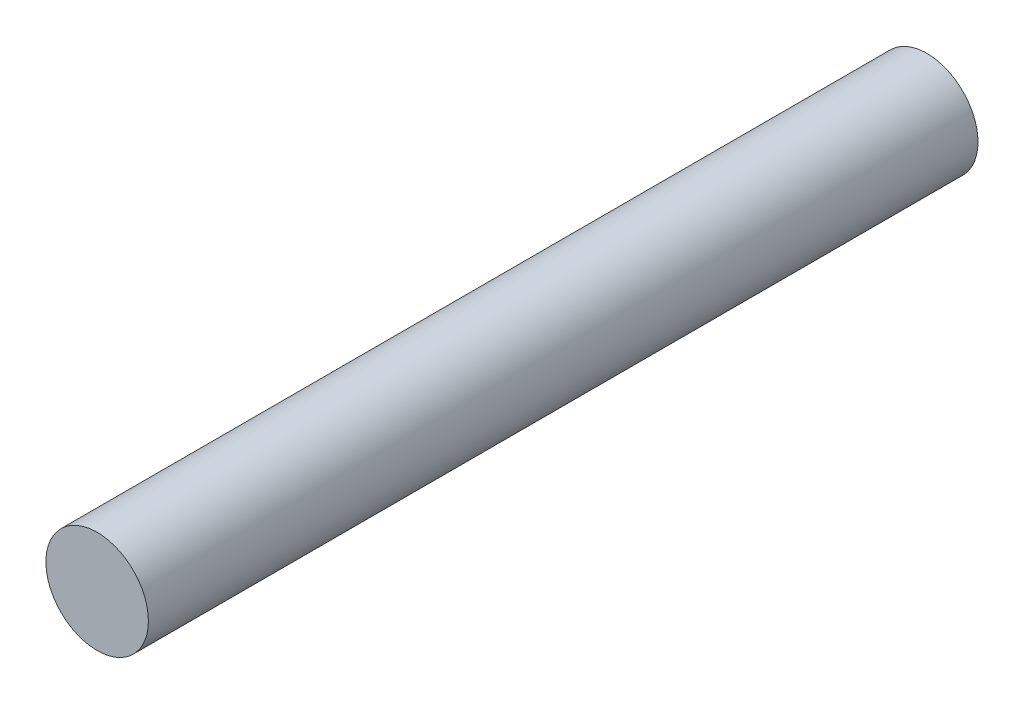
ISO-10303-21;
HEADER;
FILE_DESCRIPTION(('STEP AP214'),'2;1');
FILE_NAME('part.step','',(''),(''),'','','');
FILE_SCHEMA(('AUTOMOTIVE_DESIGN { 1 0 10303 214 1 1 1 1 }'));
ENDSEC;
DATA;
#1=APPLICATION_CONTEXT('core data for automotive mechanical design processes');
#2=APPLICATION_PROTOCOL_DEFINITION('international standard','automotive_design',2000,#1);
#3=PRODUCT_CONTEXT('',#1,'mechanical');
#4=PRODUCT('Part','Part','',(#3));
#5=PRODUCT_RELATED_PRODUCT_CATEGORY('part','',(#4));
#6=PRODUCT_DEFINITION_FORMATION('','',#4);
#7=PRODUCT_DEFINITION_CONTEXT('part definition',#1,'design');
#8=PRODUCT_DEFINITION('design','',#6,#7);
#9=PRODUCT_DEFINITION_SHAPE('','',#8);
#10=(LENGTH_UNIT() NAMED_UNIT(*) SI_UNIT(.MILLI.,.METRE.));
#11=(NAMED_UNIT(*) PLANE_ANGLE_UNIT() SI_UNIT($,.RADIAN.));
#12=(NAMED_UNIT(*) SI_UNIT($,.STERADIAN.) SOLID_ANGLE_UNIT());
#13=UNCERTAINTY_MEASURE_WITH_UNIT(LENGTH_MEASURE(1.E-05),#10,'distance_accuracy_value','');
#14=(GEOMETRIC_REPRESENTATION_CONTEXT(3) GLOBAL_UNCERTAINTY_ASSIGNED_CONTEXT((#13)) GLOBAL_UNIT_ASSIGNED_CONTEXT((#10,
#11,#12)) REPRESENTATION_CONTEXT('',''));
#15=CARTESIAN_POINT('',(0.,0.,0.));
#16=DIRECTION('',(0.,0.,1.));
#17=DIRECTION('',(1.,0.,0.));
#18=AXIS2_PLACEMENT_3D('',#15,#16,#17);
#19=CARTESIAN_POINT('',(0.,0.,80.95));
#20=DIRECTION('',(0.,0.,-1.));
#21=DIRECTION('',(-1.,0.,0.));
#22=AXIS2_PLACEMENT_3D('',#19,#20,#21);
#23=CYLINDRICAL_SURFACE('',#22,5.);
#24=CARTESIAN_POINT('',(0.,0.,80.95));
#25=DIRECTION('',(0.,0.,1.));
#26=DIRECTION('',(1.,0.,0.));
#27=AXIS2_PLACEMENT_3D('',#24,#25,#26);
#28=CIRCLE('',#27,5.);
#29=CARTESIAN_POINT('',(5.,0.,80.95));
#30=VERTEX_POINT('',#29);
#31=EDGE_CURVE('E10',#30,#30,#28,.T.);
#32=ORIENTED_EDGE('',*,*,#31,.F.);
#33=EDGE_LOOP('',(#32));
#34=FACE_BOUND('',#33,.T.);
#35=CARTESIAN_POINT('',(0.,0.,0.));
#36=DIRECTION('',(0.,0.,1.));
#37=DIRECTION('',(1.,0.,0.));
#38=AXIS2_PLACEMENT_3D('',#35,#36,#37);
#39=CIRCLE('',#38,5.);
#40=CARTESIAN_POINT('',(5.,0.,0.));
#41=VERTEX_POINT('',#40);
#42=EDGE_CURVE('E42',#41,#41,#39,.T.);
#43=ORIENTED_EDGE('',*,*,#42,.T.);
#44=EDGE_LOOP('',(#43));
#45=FACE_BOUND('',#44,.T.);
#46=ADVANCED_FACE('F39',(#34,#45),#23,.T.);
#47=CARTESIAN_POINT('',(0.,0.,80.95));
#48=DIRECTION('',(0.,0.,1.));
#49=DIRECTION('',(1.,0.,0.));
#50=AXIS2_PLACEMENT_3D('',#47,#48,#49);
#51=PLANE('',#50);
#52=ORIENTED_EDGE('',*,*,#31,.T.);
#53=EDGE_LOOP('',(#52));
#54=FACE_BOUND('',#53,.T.);
#55=ADVANCED_FACE('F54',(#54),#51,.T.);
#56=CARTESIAN_POINT('',(0.,0.,0.));
#57=DIRECTION('',(0.,0.,1.));
#58=DIRECTION('',(1.,0.,0.));
#59=AXIS2_PLACEMENT_3D('',#56,#57,#58);
#60=PLANE('',#59);
#61=ORIENTED_EDGE('',*,*,#42,.F.);
#62=EDGE_LOOP('',(#61));
#63=FACE_BOUND('',#62,.T.);
#64=ADVANCED_FACE('F52',(#63),#60,.F.);
#65=CLOSED_SHELL('',(#46,#55,#64));
#66=MANIFOLD_SOLID_BREP('B2',#65);
#67=ADVANCED_BREP_SHAPE_REPRESENTATION('',(#18,#66),#14);
#68=SHAPE_DEFINITION_REPRESENTATION(#9,#67);
ENDSEC;
END-ISO-10303-21;
